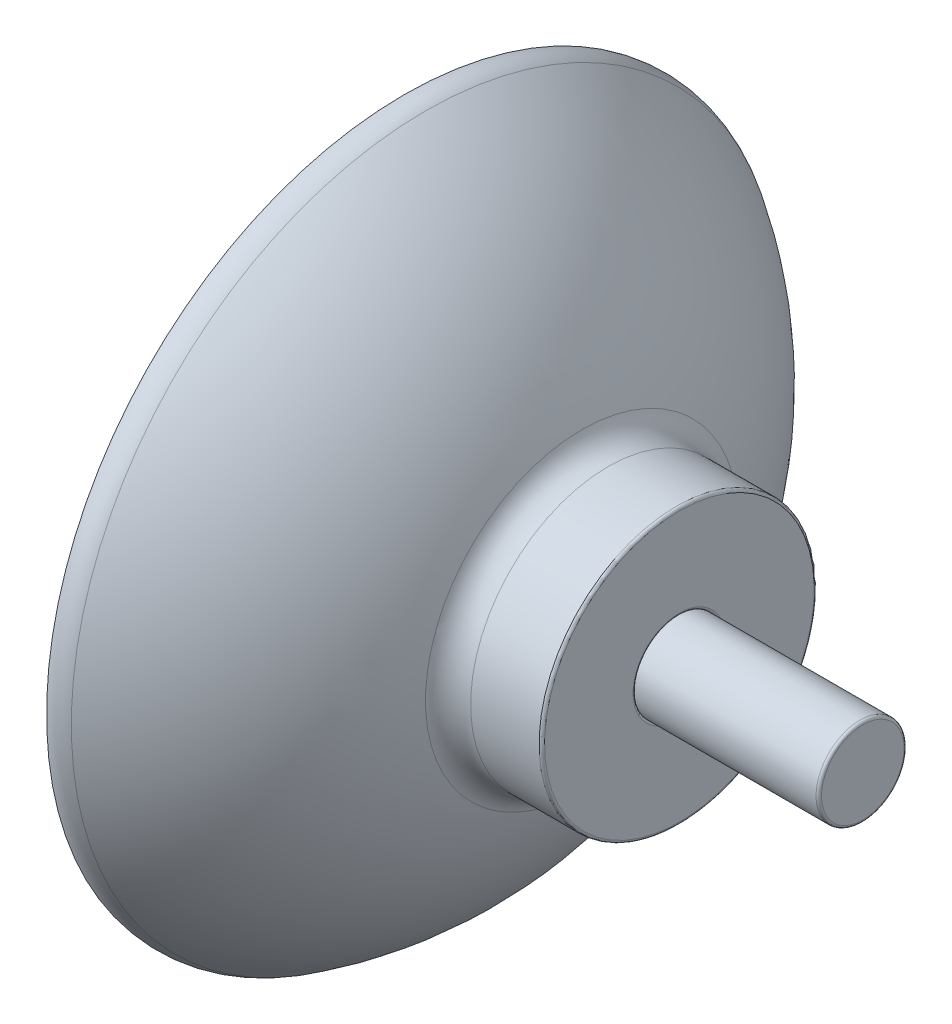
ISO-10303-21;
HEADER;
FILE_DESCRIPTION(('STEP AP214'),'2;1');
FILE_NAME('part.step','',(''),(''),'','','');
FILE_SCHEMA(('AUTOMOTIVE_DESIGN { 1 0 10303 214 1 1 1 1 }'));
ENDSEC;
DATA;
#1=APPLICATION_CONTEXT('core data for automotive mechanical design processes');
#2=APPLICATION_PROTOCOL_DEFINITION('international standard','automotive_design',2000,#1);
#3=PRODUCT_CONTEXT('',#1,'mechanical');
#4=PRODUCT('Part','Part','',(#3));
#5=PRODUCT_RELATED_PRODUCT_CATEGORY('part','',(#4));
#6=PRODUCT_DEFINITION_FORMATION('','',#4);
#7=PRODUCT_DEFINITION_CONTEXT('part definition',#1,'design');
#8=PRODUCT_DEFINITION('design','',#6,#7);
#9=PRODUCT_DEFINITION_SHAPE('','',#8);
#10=(LENGTH_UNIT() NAMED_UNIT(*) SI_UNIT(.MILLI.,.METRE.));
#11=(NAMED_UNIT(*) PLANE_ANGLE_UNIT() SI_UNIT($,.RADIAN.));
#12=(NAMED_UNIT(*) SI_UNIT($,.STERADIAN.) SOLID_ANGLE_UNIT());
#13=UNCERTAINTY_MEASURE_WITH_UNIT(LENGTH_MEASURE(1.E-05),#10,'distance_accuracy_value','');
#14=(GEOMETRIC_REPRESENTATION_CONTEXT(3) GLOBAL_UNCERTAINTY_ASSIGNED_CONTEXT((#13)) GLOBAL_UNIT_ASSIGNED_CONTEXT((#10,
#11,#12)) REPRESENTATION_CONTEXT('',''));
#15=CARTESIAN_POINT('',(0.,0.,0.));
#16=DIRECTION('',(0.,0.,1.));
#17=DIRECTION('',(1.,0.,0.));
#18=AXIS2_PLACEMENT_3D('',#15,#16,#17);
#19=CARTESIAN_POINT('',(2.,0.,0.));
#20=DIRECTION('',(-1.,0.,0.));
#21=DIRECTION('',(0.,-1.,0.));
#22=AXIS2_PLACEMENT_3D('',#19,#20,#21);
#23=PLANE('',#22);
#24=CARTESIAN_POINT('',(2.,0.,0.));
#25=DIRECTION('',(1.,0.,0.));
#26=DIRECTION('',(0.,1.,0.));
#27=AXIS2_PLACEMENT_3D('',#24,#25,#26);
#28=CIRCLE('',#27,4.75);
#29=CARTESIAN_POINT('',(2.,4.75,0.));
#30=VERTEX_POINT('',#29);
#31=EDGE_CURVE('E52',#30,#30,#28,.T.);
#32=ORIENTED_EDGE('',*,*,#31,.F.);
#33=EDGE_LOOP('',(#32));
#34=FACE_BOUND('',#33,.T.);
#35=ADVANCED_FACE('F41',(#34),#23,.T.);
#36=CARTESIAN_POINT('',(15.,0.,0.));
#37=DIRECTION('',(1.,0.,0.));
#38=DIRECTION('',(0.,1.,0.));
#39=AXIS2_PLACEMENT_3D('',#36,#37,#38);
#40=CYLINDRICAL_SURFACE('',#39,4.75);
#41=ORIENTED_EDGE('',*,*,#31,.T.);
#42=EDGE_LOOP('',(#41));
#43=FACE_BOUND('',#42,.T.);
#44=CARTESIAN_POINT('',(4.,0.,0.));
#45=DIRECTION('',(1.,0.,0.));
#46=DIRECTION('',(0.,1.,0.));
#47=AXIS2_PLACEMENT_3D('',#44,#45,#46);
#48=CIRCLE('',#47,4.75);
#49=CARTESIAN_POINT('',(4.,4.75,0.));
#50=VERTEX_POINT('',#49);
#51=EDGE_CURVE('E56',#50,#50,#48,.T.);
#52=ORIENTED_EDGE('',*,*,#51,.F.);
#53=EDGE_LOOP('',(#52));
#54=FACE_BOUND('',#53,.T.);
#55=ADVANCED_FACE('F69',(#43,#54),#40,.T.);
#56=CARTESIAN_POINT('',(4.,4.75,0.));
#57=DIRECTION('',(1.,0.,0.));
#58=DIRECTION('',(0.,1.,0.));
#59=AXIS2_PLACEMENT_3D('',#56,#57,#58);
#60=PLANE('',#59);
#61=ORIENTED_EDGE('',*,*,#51,.T.);
#62=EDGE_LOOP('',(#61));
#63=FACE_BOUND('',#62,.T.);
#64=CARTESIAN_POINT('',(4.,0.,0.));
#65=DIRECTION('',(1.,0.,0.));
#66=DIRECTION('',(0.,1.,0.));
#67=AXIS2_PLACEMENT_3D('',#64,#65,#66);
#68=CIRCLE('',#67,2.4);
#69=CARTESIAN_POINT('',(4.,2.4,0.));
#70=VERTEX_POINT('',#69);
#71=EDGE_CURVE('E61',#70,#70,#68,.T.);
#72=ORIENTED_EDGE('',*,*,#71,.F.);
#73=EDGE_LOOP('',(#72));
#74=FACE_BOUND('',#73,.T.);
#75=ADVANCED_FACE('F67',(#63,#74),#60,.T.);
#76=CARTESIAN_POINT('',(15.,0.,0.));
#77=DIRECTION('',(1.,0.,0.));
#78=DIRECTION('',(0.,1.,0.));
#79=AXIS2_PLACEMENT_3D('',#76,#77,#78);
#80=CYLINDRICAL_SURFACE('',#79,2.4);
#81=CARTESIAN_POINT('',(14.85,0.,0.));
#82=DIRECTION('',(1.,0.,0.));
#83=DIRECTION('',(0.,1.,0.));
#84=AXIS2_PLACEMENT_3D('',#81,#82,#83);
#85=CIRCLE('',#84,2.4);
#86=CARTESIAN_POINT('',(14.85,2.4,0.));
#87=VERTEX_POINT('',#86);
#88=EDGE_CURVE('E11',#87,#87,#85,.F.);
#89=ORIENTED_EDGE('',*,*,#88,.T.);
#90=EDGE_LOOP('',(#89));
#91=FACE_BOUND('',#90,.T.);
#92=ORIENTED_EDGE('',*,*,#71,.T.);
#93=EDGE_LOOP('',(#92));
#94=FACE_BOUND('',#93,.T.);
#95=ADVANCED_FACE('F65',(#91,#94),#80,.T.);
#96=CARTESIAN_POINT('',(15.,2.4,0.));
#97=DIRECTION('',(1.,0.,0.));
#98=DIRECTION('',(0.,1.,0.));
#99=AXIS2_PLACEMENT_3D('',#96,#97,#98);
#100=PLANE('',#99);
#101=CARTESIAN_POINT('',(15.,0.,0.));
#102=DIRECTION('',(1.,0.,0.));
#103=DIRECTION('',(0.,1.,0.));
#104=AXIS2_PLACEMENT_3D('',#101,#102,#103);
#105=CIRCLE('',#104,2.25);
#106=CARTESIAN_POINT('',(15.,2.25,0.));
#107=VERTEX_POINT('',#106);
#108=EDGE_CURVE('E48',#107,#107,#105,.T.);
#109=ORIENTED_EDGE('',*,*,#108,.T.);
#110=EDGE_LOOP('',(#109));
#111=FACE_BOUND('',#110,.T.);
#112=ADVANCED_FACE('F76',(#111),#100,.T.);
#113=CARTESIAN_POINT('',(14.85,0.,0.));
#114=DIRECTION('',(1.,0.,0.));
#115=DIRECTION('',(0.,1.,0.));
#116=AXIS2_PLACEMENT_3D('',#113,#114,#115);
#117=TOROIDAL_SURFACE('',#116,2.25,0.15);
#118=ORIENTED_EDGE('',*,*,#88,.F.);
#119=EDGE_LOOP('',(#118));
#120=FACE_BOUND('',#119,.T.);
#121=ORIENTED_EDGE('',*,*,#108,.F.);
#122=EDGE_LOOP('',(#121));
#123=FACE_BOUND('',#122,.T.);
#124=ADVANCED_FACE('F43',(#120,#123),#117,.T.);
#125=CLOSED_SHELL('',(#35,#55,#75,#95,#112,#124));
#126=MANIFOLD_SOLID_BREP('B2',#125);
#127=CARTESIAN_POINT('',(-21.7835977429209,0.,0.));
#128=DIRECTION('',(1.,0.,0.));
#129=DIRECTION('',(0.,1.,0.));
#130=AXIS2_PLACEMENT_3D('',#127,#128,#129);
#131=DEGENERATE_TOROIDAL_SURFACE('',#130,0.921872423922007,22.,.T.);
#132=CARTESIAN_POINT('',(0.,0.,0.));
#133=DIRECTION('',(1.,0.,0.));
#134=DIRECTION('',(0.,1.,0.));
#135=AXIS2_PLACEMENT_3D('',#132,#133,#134);
#136=CIRCLE('',#135,3.99999999999999);
#137=CARTESIAN_POINT('',(0.,3.99999999999999,0.));
#138=VERTEX_POINT('',#137);
#139=EDGE_CURVE('E165',#138,#138,#136,.T.);
#140=ORIENTED_EDGE('',*,*,#139,.T.);
#141=EDGE_LOOP('',(#140));
#142=FACE_BOUND('',#141,.T.);
#143=CARTESIAN_POINT('',(-10.,0.,0.));
#144=DIRECTION('',(1.,0.,0.));
#145=DIRECTION('',(0.,1.,0.));
#146=AXIS2_PLACEMENT_3D('',#143,#144,#145);
#147=CIRCLE('',#146,19.5);
#148=CARTESIAN_POINT('',(-10.,19.5,0.));
#149=VERTEX_POINT('',#148);
#150=EDGE_CURVE('E162',#149,#149,#147,.T.);
#151=ORIENTED_EDGE('',*,*,#150,.F.);
#152=EDGE_LOOP('',(#151));
#153=FACE_BOUND('',#152,.T.);
#154=ADVANCED_FACE('F127',(#142,#153),#131,.F.);
#155=CARTESIAN_POINT('',(0.,0.,0.));
#156=DIRECTION('',(1.,0.,0.));
#157=DIRECTION('',(0.,1.,0.));
#158=AXIS2_PLACEMENT_3D('',#155,#156,#157);
#159=PLANE('',#158);
#160=ORIENTED_EDGE('',*,*,#139,.F.);
#161=EDGE_LOOP('',(#160));
#162=FACE_BOUND('',#161,.T.);
#163=ADVANCED_FACE('F193',(#162),#159,.F.);
#164=CARTESIAN_POINT('',(2.,0.,0.));
#165=DIRECTION('',(1.,0.,0.));
#166=DIRECTION('',(0.,1.,0.));
#167=AXIS2_PLACEMENT_3D('',#164,#165,#166);
#168=PLANE('',#167);
#169=CARTESIAN_POINT('',(2.,0.,0.));
#170=DIRECTION('',(1.,0.,0.));
#171=DIRECTION('',(0.,1.,0.));
#172=AXIS2_PLACEMENT_3D('',#169,#170,#171);
#173=CIRCLE('',#172,4.75);
#174=CARTESIAN_POINT('',(2.,4.75,0.));
#175=VERTEX_POINT('',#174);
#176=EDGE_CURVE('E168',#175,#175,#173,.T.);
#177=ORIENTED_EDGE('',*,*,#176,.T.);
#178=EDGE_LOOP('',(#177));
#179=FACE_BOUND('',#178,.T.);
#180=ADVANCED_FACE('F190',(#179),#168,.T.);
#181=CARTESIAN_POINT('',(0.,0.,0.));
#182=DIRECTION('',(1.,0.,0.));
#183=DIRECTION('',(0.,1.,0.));
#184=AXIS2_PLACEMENT_3D('',#181,#182,#183);
#185=CYLINDRICAL_SURFACE('',#184,4.75);
#186=CARTESIAN_POINT('',(4.,0.,0.));
#187=DIRECTION('',(1.,0.,0.));
#188=DIRECTION('',(0.,1.,0.));
#189=AXIS2_PLACEMENT_3D('',#186,#187,#188);
#190=CIRCLE('',#189,4.75);
#191=CARTESIAN_POINT('',(4.,4.75,0.));
#192=VERTEX_POINT('',#191);
#193=EDGE_CURVE('E171',#192,#192,#190,.T.);
#194=ORIENTED_EDGE('',*,*,#193,.T.);
#195=EDGE_LOOP('',(#194));
#196=FACE_BOUND('',#195,.T.);
#197=ORIENTED_EDGE('',*,*,#176,.F.);
#198=EDGE_LOOP('',(#197));
#199=FACE_BOUND('',#198,.T.);
#200=ADVANCED_FACE('F175',(#196,#199),#185,.F.);
#201=CARTESIAN_POINT('',(4.,0.,0.));
#202=DIRECTION('',(1.,0.,0.));
#203=DIRECTION('',(0.,1.,0.));
#204=AXIS2_PLACEMENT_3D('',#201,#202,#203);
#205=PLANE('',#204);
#206=CARTESIAN_POINT('',(4.,0.,0.));
#207=DIRECTION('',(1.,0.,0.));
#208=DIRECTION('',(0.,1.,0.));
#209=AXIS2_PLACEMENT_3D('',#206,#207,#208);
#210=CIRCLE('',#209,2.525);
#211=CARTESIAN_POINT('',(4.,2.525,0.));
#212=VERTEX_POINT('',#211);
#213=EDGE_CURVE('E150',#212,#212,#210,.T.);
#214=ORIENTED_EDGE('',*,*,#213,.T.);
#215=EDGE_LOOP('',(#214));
#216=FACE_BOUND('',#215,.T.);
#217=ORIENTED_EDGE('',*,*,#193,.F.);
#218=EDGE_LOOP('',(#217));
#219=FACE_BOUND('',#218,.T.);
#220=ADVANCED_FACE('F178',(#216,#219),#205,.F.);
#221=CARTESIAN_POINT('',(0.,0.,0.));
#222=DIRECTION('',(1.,0.,0.));
#223=DIRECTION('',(0.,1.,0.));
#224=AXIS2_PLACEMENT_3D('',#221,#222,#223);
#225=CYLINDRICAL_SURFACE('',#224,2.375);
#226=CARTESIAN_POINT('',(4.15,0.,0.));
#227=DIRECTION('',(1.,0.,0.));
#228=DIRECTION('',(0.,1.,0.));
#229=AXIS2_PLACEMENT_3D('',#226,#227,#228);
#230=CIRCLE('',#229,2.375);
#231=CARTESIAN_POINT('',(4.15,2.375,0.));
#232=VERTEX_POINT('',#231);
#233=EDGE_CURVE('E142',#232,#232,#230,.F.);
#234=ORIENTED_EDGE('',*,*,#233,.T.);
#235=EDGE_LOOP('',(#234));
#236=FACE_BOUND('',#235,.T.);
#237=CARTESIAN_POINT('',(4.85,0.,0.));
#238=DIRECTION('',(1.,0.,0.));
#239=DIRECTION('',(0.,1.,0.));
#240=AXIS2_PLACEMENT_3D('',#237,#238,#239);
#241=CIRCLE('',#240,2.375);
#242=CARTESIAN_POINT('',(4.85,2.375,0.));
#243=VERTEX_POINT('',#242);
#244=EDGE_CURVE('E147',#243,#243,#241,.T.);
#245=ORIENTED_EDGE('',*,*,#244,.T.);
#246=EDGE_LOOP('',(#245));
#247=FACE_BOUND('',#246,.T.);
#248=ADVANCED_FACE('F180',(#236,#247),#225,.F.);
#249=CARTESIAN_POINT('',(5.,0.,0.));
#250=DIRECTION('',(1.,0.,0.));
#251=DIRECTION('',(0.,1.,0.));
#252=AXIS2_PLACEMENT_3D('',#249,#250,#251);
#253=PLANE('',#252);
#254=CARTESIAN_POINT('',(5.,0.,0.));
#255=DIRECTION('',(1.,0.,0.));
#256=DIRECTION('',(0.,1.,0.));
#257=AXIS2_PLACEMENT_3D('',#254,#255,#256);
#258=CIRCLE('',#257,7.35);
#259=CARTESIAN_POINT('',(5.,7.35,0.));
#260=VERTEX_POINT('',#259);
#261=EDGE_CURVE('E156',#260,#260,#258,.T.);
#262=ORIENTED_EDGE('',*,*,#261,.T.);
#263=EDGE_LOOP('',(#262));
#264=FACE_BOUND('',#263,.T.);
#265=CARTESIAN_POINT('',(5.,0.,0.));
#266=DIRECTION('',(1.,0.,0.));
#267=DIRECTION('',(0.,1.,0.));
#268=AXIS2_PLACEMENT_3D('',#265,#266,#267);
#269=CIRCLE('',#268,2.525);
#270=CARTESIAN_POINT('',(5.,2.525,0.));
#271=VERTEX_POINT('',#270);
#272=EDGE_CURVE('E159',#271,#271,#269,.F.);
#273=ORIENTED_EDGE('',*,*,#272,.T.);
#274=EDGE_LOOP('',(#273));
#275=FACE_BOUND('',#274,.T.);
#276=ADVANCED_FACE('F187',(#264,#275),#253,.T.);
#277=CARTESIAN_POINT('',(0.,0.,0.));
#278=DIRECTION('',(1.,0.,0.));
#279=DIRECTION('',(0.,1.,0.));
#280=AXIS2_PLACEMENT_3D('',#277,#278,#279);
#281=CYLINDRICAL_SURFACE('',#280,7.5);
#282=CARTESIAN_POINT('',(1.11723092580122,0.,0.));
#283=DIRECTION('',(1.,0.,0.));
#284=DIRECTION('',(0.,1.,0.));
#285=AXIS2_PLACEMENT_3D('',#282,#283,#284);
#286=CIRCLE('',#285,7.5);
#287=CARTESIAN_POINT('',(1.11723092580122,7.5,0.));
#288=VERTEX_POINT('',#287);
#289=EDGE_CURVE('E138',#288,#288,#286,.T.);
#290=ORIENTED_EDGE('',*,*,#289,.T.);
#291=EDGE_LOOP('',(#290));
#292=FACE_BOUND('',#291,.T.);
#293=CARTESIAN_POINT('',(4.85,0.,0.));
#294=DIRECTION('',(1.,0.,0.));
#295=DIRECTION('',(0.,1.,0.));
#296=AXIS2_PLACEMENT_3D('',#293,#294,#295);
#297=CIRCLE('',#296,7.5);
#298=CARTESIAN_POINT('',(4.85,7.5,0.));
#299=VERTEX_POINT('',#298);
#300=EDGE_CURVE('E153',#299,#299,#297,.F.);
#301=ORIENTED_EDGE('',*,*,#300,.T.);
#302=EDGE_LOOP('',(#301));
#303=FACE_BOUND('',#302,.T.);
#304=ADVANCED_FACE('F226',(#292,#303),#281,.T.);
#305=CARTESIAN_POINT('',(-19.3122304000596,0.,0.));
#306=DIRECTION('',(1.,0.,0.));
#307=DIRECTION('',(0.,1.,0.));
#308=AXIS2_PLACEMENT_3D('',#305,#306,#307);
#309=DEGENERATE_TOROIDAL_SURFACE('',#308,2.30021567995232,20.,.T.);
#310=CARTESIAN_POINT('',(-0.308080329491398,0.,0.));
#311=DIRECTION('',(-1.,0.,0.));
#312=DIRECTION('',(0.,-1.,0.));
#313=AXIS2_PLACEMENT_3D('',#310,#311,#312);
#314=CIRCLE('',#313,8.53257318697341);
#315=CARTESIAN_POINT('',(-0.308080329491397,-8.53257318697341,0.));
#316=VERTEX_POINT('',#315);
#317=EDGE_CURVE('E40',#316,#316,#314,.T.);
#318=ORIENTED_EDGE('',*,*,#317,.T.);
#319=EDGE_LOOP('',(#318));
#320=FACE_BOUND('',#319,.T.);
#321=CARTESIAN_POINT('',(-8.82290536756028,0.,0.));
#322=DIRECTION('',(-1.,0.,0.));
#323=DIRECTION('',(0.,-1.,0.));
#324=AXIS2_PLACEMENT_3D('',#321,#322,#323);
#325=CIRCLE('',#324,19.328840414868);
#326=CARTESIAN_POINT('',(-8.82290536756028,-19.328840414868,0.));
#327=VERTEX_POINT('',#326);
#328=EDGE_CURVE('E134',#327,#327,#325,.F.);
#329=ORIENTED_EDGE('',*,*,#328,.T.);
#330=EDGE_LOOP('',(#329));
#331=FACE_BOUND('',#330,.T.);
#332=ADVANCED_FACE('F208',(#320,#331),#309,.T.);
#333=CARTESIAN_POINT('',(4.85,0.,0.));
#334=DIRECTION('',(1.,0.,0.));
#335=DIRECTION('',(0.,1.,0.));
#336=AXIS2_PLACEMENT_3D('',#333,#334,#335);
#337=TOROIDAL_SURFACE('',#336,7.35,0.15);
#338=ORIENTED_EDGE('',*,*,#300,.F.);
#339=EDGE_LOOP('',(#338));
#340=FACE_BOUND('',#339,.T.);
#341=ORIENTED_EDGE('',*,*,#261,.F.);
#342=EDGE_LOOP('',(#341));
#343=FACE_BOUND('',#342,.T.);
#344=ADVANCED_FACE('F204',(#340,#343),#337,.T.);
#345=CARTESIAN_POINT('',(4.15,0.,0.));
#346=DIRECTION('',(1.,0.,0.));
#347=DIRECTION('',(0.,1.,0.));
#348=AXIS2_PLACEMENT_3D('',#345,#346,#347);
#349=TOROIDAL_SURFACE('',#348,2.525,0.15);
#350=ORIENTED_EDGE('',*,*,#233,.F.);
#351=EDGE_LOOP('',(#350));
#352=FACE_BOUND('',#351,.T.);
#353=ORIENTED_EDGE('',*,*,#213,.F.);
#354=EDGE_LOOP('',(#353));
#355=FACE_BOUND('',#354,.T.);
#356=ADVANCED_FACE('F207',(#352,#355),#349,.T.);
#357=CARTESIAN_POINT('',(4.85,0.,0.));
#358=DIRECTION('',(1.,0.,0.));
#359=DIRECTION('',(0.,1.,0.));
#360=AXIS2_PLACEMENT_3D('',#357,#358,#359);
#361=TOROIDAL_SURFACE('',#360,2.525,0.15);
#362=ORIENTED_EDGE('',*,*,#272,.F.);
#363=EDGE_LOOP('',(#362));
#364=FACE_BOUND('',#363,.T.);
#365=ORIENTED_EDGE('',*,*,#244,.F.);
#366=EDGE_LOOP('',(#365));
#367=FACE_BOUND('',#366,.T.);
#368=ADVANCED_FACE('F212',(#364,#367),#361,.T.);
#369=CARTESIAN_POINT('',(1.11723092580122,0.,0.));
#370=DIRECTION('',(1.,0.,0.));
#371=DIRECTION('',(0.,1.,0.));
#372=AXIS2_PLACEMENT_3D('',#369,#370,#371);
#373=TOROIDAL_SURFACE('',#372,9.,1.5);
#374=ORIENTED_EDGE('',*,*,#317,.F.);
#375=EDGE_LOOP('',(#374));
#376=FACE_BOUND('',#375,.T.);
#377=ORIENTED_EDGE('',*,*,#289,.F.);
#378=EDGE_LOOP('',(#377));
#379=FACE_BOUND('',#378,.T.);
#380=ADVANCED_FACE('F215',(#376,#379),#373,.F.);
#381=CARTESIAN_POINT('',(-9.60960474499774,0.,0.));
#382=DIRECTION('',(-1.,0.,0.));
#383=DIRECTION('',(0.,-1.,0.));
#384=AXIS2_PLACEMENT_3D('',#381,#382,#383);
#385=TOROIDAL_SURFACE('',#384,18.0516935597493,1.5);
#386=ORIENTED_EDGE('',*,*,#150,.T.);
#387=EDGE_LOOP('',(#386));
#388=FACE_BOUND('',#387,.T.);
#389=ORIENTED_EDGE('',*,*,#328,.F.);
#390=EDGE_LOOP('',(#389));
#391=FACE_BOUND('',#390,.T.);
#392=ADVANCED_FACE('F129',(#388,#391),#385,.T.);
#393=CLOSED_SHELL('',(#154,#163,#180,#200,#220,#248,#276,#304,#332,#344,#356,#368,#380,#392));
#394=MANIFOLD_SOLID_BREP('B6',#393);
#395=ADVANCED_BREP_SHAPE_REPRESENTATION('',(#18,#126,#394),#14);
#396=SHAPE_DEFINITION_REPRESENTATION(#9,#395);
ENDSEC;
END-ISO-10303-21;
